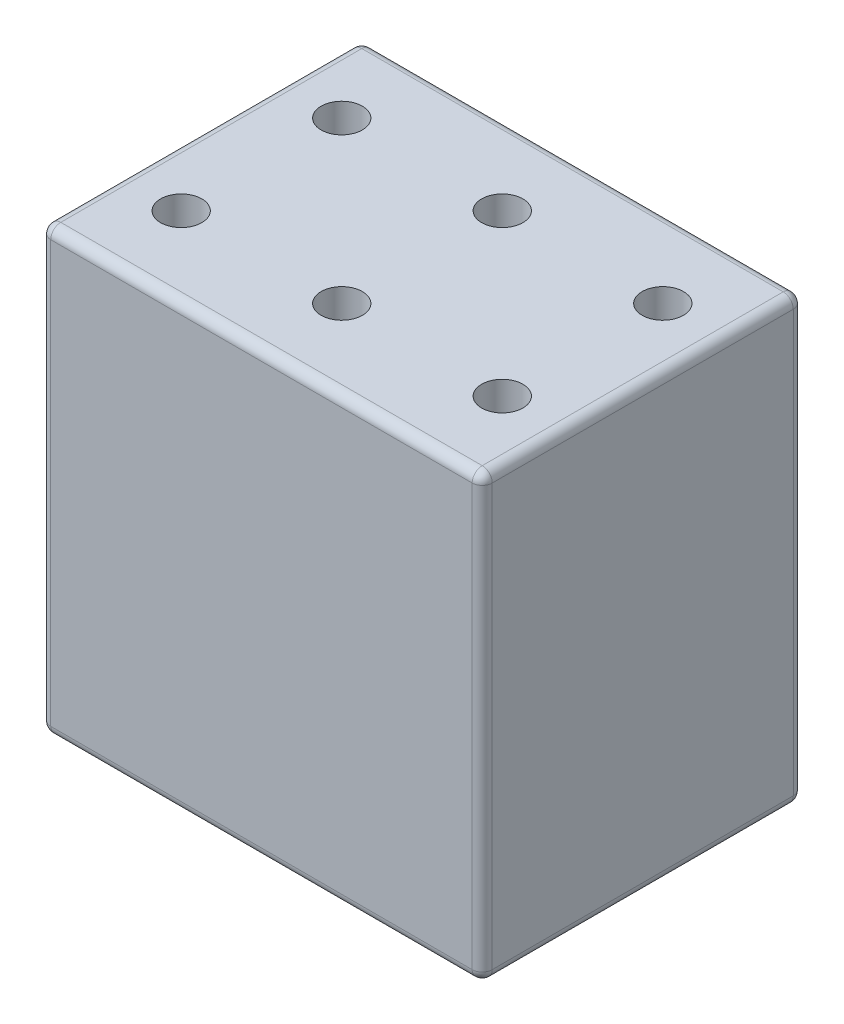
ISO-10303-21;
HEADER;
FILE_DESCRIPTION(('STEP AP214'),'2;1');
FILE_NAME('part.step','',(''),(''),'','','');
FILE_SCHEMA(('AUTOMOTIVE_DESIGN { 1 0 10303 214 1 1 1 1 }'));
ENDSEC;
DATA;
#1=APPLICATION_CONTEXT('core data for automotive mechanical design processes');
#2=APPLICATION_PROTOCOL_DEFINITION('international standard','automotive_design',2000,#1);
#3=PRODUCT_CONTEXT('',#1,'mechanical');
#4=PRODUCT('Part','Part','',(#3));
#5=PRODUCT_RELATED_PRODUCT_CATEGORY('part','',(#4));
#6=PRODUCT_DEFINITION_FORMATION('','',#4);
#7=PRODUCT_DEFINITION_CONTEXT('part definition',#1,'design');
#8=PRODUCT_DEFINITION('design','',#6,#7);
#9=PRODUCT_DEFINITION_SHAPE('','',#8);
#10=(LENGTH_UNIT() NAMED_UNIT(*) SI_UNIT(.MILLI.,.METRE.));
#11=(NAMED_UNIT(*) PLANE_ANGLE_UNIT() SI_UNIT($,.RADIAN.));
#12=(NAMED_UNIT(*) SI_UNIT($,.STERADIAN.) SOLID_ANGLE_UNIT());
#13=UNCERTAINTY_MEASURE_WITH_UNIT(LENGTH_MEASURE(1.E-05),#10,'distance_accuracy_value','');
#14=(GEOMETRIC_REPRESENTATION_CONTEXT(3) GLOBAL_UNCERTAINTY_ASSIGNED_CONTEXT((#13)) GLOBAL_UNIT_ASSIGNED_CONTEXT((#10,
#11,#12)) REPRESENTATION_CONTEXT('',''));
#15=CARTESIAN_POINT('',(0.,0.,0.));
#16=DIRECTION('',(0.,0.,1.));
#17=DIRECTION('',(1.,0.,0.));
#18=AXIS2_PLACEMENT_3D('',#15,#16,#17);
#19=CARTESIAN_POINT('',(0.,69.85,0.));
#20=DIRECTION('',(0.,-1.,0.));
#21=DIRECTION('',(0.,0.,-1.));
#22=AXIS2_PLACEMENT_3D('',#19,#20,#21);
#23=PLANE('',#22);
#24=DIRECTION('',(1.,0.,0.));
#25=VECTOR('',#24,1.);
#26=CARTESIAN_POINT('',(0.,69.85,23.8125));
#27=LINE('',#26,#25);
#28=CARTESIAN_POINT('',(-33.3375,69.85,23.8125));
#29=VERTEX_POINT('',#28);
#30=CARTESIAN_POINT('',(33.3375,69.85,23.8125));
#31=VERTEX_POINT('',#30);
#32=EDGE_CURVE('E164',#29,#31,#27,.T.);
#33=ORIENTED_EDGE('',*,*,#32,.T.);
#34=DIRECTION('',(0.,0.,-1.));
#35=VECTOR('',#34,1.);
#36=CARTESIAN_POINT('',(33.3375,69.85,0.));
#37=LINE('',#36,#35);
#38=CARTESIAN_POINT('',(33.3375,69.85,-23.8125));
#39=VERTEX_POINT('',#38);
#40=EDGE_CURVE('E169',#31,#39,#37,.T.);
#41=ORIENTED_EDGE('',*,*,#40,.T.);
#42=DIRECTION('',(-1.,0.,0.));
#43=VECTOR('',#42,1.);
#44=CARTESIAN_POINT('',(0.,69.85,-23.8125));
#45=LINE('',#44,#43);
#46=CARTESIAN_POINT('',(-33.3375,69.85,-23.8125));
#47=VERTEX_POINT('',#46);
#48=EDGE_CURVE('E138',#39,#47,#45,.T.);
#49=ORIENTED_EDGE('',*,*,#48,.T.);
#50=DIRECTION('',(0.,0.,1.));
#51=VECTOR('',#50,1.);
#52=CARTESIAN_POINT('',(-33.3375,69.85,0.));
#53=LINE('',#52,#51);
#54=EDGE_CURVE('E157',#47,#29,#53,.T.);
#55=ORIENTED_EDGE('',*,*,#54,.T.);
#56=EDGE_LOOP('',(#33,#41,#49,#55));
#57=FACE_BOUND('',#56,.T.);
#58=CARTESIAN_POINT('',(-25.4,69.85,12.7));
#59=DIRECTION('',(0.,1.,0.));
#60=DIRECTION('',(0.,0.,1.));
#61=AXIS2_PLACEMENT_3D('',#58,#59,#60);
#62=CIRCLE('',#61,3.2639);
#63=CARTESIAN_POINT('',(-25.4,69.85,15.9639));
#64=VERTEX_POINT('',#63);
#65=EDGE_CURVE('E165',#64,#64,#62,.T.);
#66=ORIENTED_EDGE('',*,*,#65,.F.);
#67=EDGE_LOOP('',(#66));
#68=FACE_BOUND('',#67,.T.);
#69=CARTESIAN_POINT('',(0.,69.85,12.7));
#70=DIRECTION('',(0.,1.,0.));
#71=DIRECTION('',(0.,0.,1.));
#72=AXIS2_PLACEMENT_3D('',#69,#70,#71);
#73=CIRCLE('',#72,3.2639);
#74=CARTESIAN_POINT('',(0.,69.85,15.9639));
#75=VERTEX_POINT('',#74);
#76=EDGE_CURVE('E353',#75,#75,#73,.T.);
#77=ORIENTED_EDGE('',*,*,#76,.F.);
#78=EDGE_LOOP('',(#77));
#79=FACE_BOUND('',#78,.T.);
#80=CARTESIAN_POINT('',(25.4,69.85,12.7));
#81=DIRECTION('',(0.,1.,0.));
#82=DIRECTION('',(0.,0.,1.));
#83=AXIS2_PLACEMENT_3D('',#80,#81,#82);
#84=CIRCLE('',#83,3.2639);
#85=CARTESIAN_POINT('',(25.4,69.85,15.9639));
#86=VERTEX_POINT('',#85);
#87=EDGE_CURVE('E345',#86,#86,#84,.T.);
#88=ORIENTED_EDGE('',*,*,#87,.F.);
#89=EDGE_LOOP('',(#88));
#90=FACE_BOUND('',#89,.T.);
#91=CARTESIAN_POINT('',(0.,69.85,-12.7));
#92=DIRECTION('',(0.,1.,0.));
#93=DIRECTION('',(0.,0.,1.));
#94=AXIS2_PLACEMENT_3D('',#91,#92,#93);
#95=CIRCLE('',#94,3.2639);
#96=CARTESIAN_POINT('',(0.,69.85,-9.43609999999999));
#97=VERTEX_POINT('',#96);
#98=EDGE_CURVE('E337',#97,#97,#95,.T.);
#99=ORIENTED_EDGE('',*,*,#98,.F.);
#100=EDGE_LOOP('',(#99));
#101=FACE_BOUND('',#100,.T.);
#102=CARTESIAN_POINT('',(25.3999999999999,69.85,-12.7));
#103=DIRECTION('',(0.,1.,0.));
#104=DIRECTION('',(0.,0.,1.));
#105=AXIS2_PLACEMENT_3D('',#102,#103,#104);
#106=CIRCLE('',#105,3.2639);
#107=CARTESIAN_POINT('',(25.3999999999999,69.85,-9.43609999999999));
#108=VERTEX_POINT('',#107);
#109=EDGE_CURVE('E329',#108,#108,#106,.T.);
#110=ORIENTED_EDGE('',*,*,#109,.F.);
#111=EDGE_LOOP('',(#110));
#112=FACE_BOUND('',#111,.T.);
#113=CARTESIAN_POINT('',(-25.4000000000001,69.85,-12.7));
#114=DIRECTION('',(0.,1.,0.));
#115=DIRECTION('',(0.,0.,1.));
#116=AXIS2_PLACEMENT_3D('',#113,#114,#115);
#117=CIRCLE('',#116,3.2639);
#118=CARTESIAN_POINT('',(-25.4000000000001,69.85,-9.43609999999999));
#119=VERTEX_POINT('',#118);
#120=EDGE_CURVE('E320',#119,#119,#117,.T.);
#121=ORIENTED_EDGE('',*,*,#120,.F.);
#122=EDGE_LOOP('',(#121));
#123=FACE_BOUND('',#122,.T.);
#124=ADVANCED_FACE('F43',(#57,#68,#79,#90,#101,#112,#123),#23,.F.);
#125=CARTESIAN_POINT('',(0.,0.,0.));
#126=DIRECTION('',(0.,-1.,0.));
#127=DIRECTION('',(0.,0.,-1.));
#128=AXIS2_PLACEMENT_3D('',#125,#126,#127);
#129=PLANE('',#128);
#130=DIRECTION('',(-1.,0.,0.));
#131=VECTOR('',#130,1.);
#132=CARTESIAN_POINT('',(34.925,0.,-23.8125));
#133=LINE('',#132,#131);
#134=CARTESIAN_POINT('',(-33.3375,0.,-23.8125));
#135=VERTEX_POINT('',#134);
#136=CARTESIAN_POINT('',(33.3375,0.,-23.8125));
#137=VERTEX_POINT('',#136);
#138=EDGE_CURVE('E195',#135,#137,#133,.F.);
#139=ORIENTED_EDGE('',*,*,#138,.T.);
#140=DIRECTION('',(0.,0.,-1.));
#141=VECTOR('',#140,1.);
#142=CARTESIAN_POINT('',(33.3375,0.,25.4));
#143=LINE('',#142,#141);
#144=CARTESIAN_POINT('',(33.3375,0.,23.8125));
#145=VERTEX_POINT('',#144);
#146=EDGE_CURVE('E199',#137,#145,#143,.F.);
#147=ORIENTED_EDGE('',*,*,#146,.T.);
#148=DIRECTION('',(1.,0.,0.));
#149=VECTOR('',#148,1.);
#150=CARTESIAN_POINT('',(-34.925,0.,23.8125));
#151=LINE('',#150,#149);
#152=CARTESIAN_POINT('',(-33.3375,0.,23.8125));
#153=VERTEX_POINT('',#152);
#154=EDGE_CURVE('E192',#145,#153,#151,.F.);
#155=ORIENTED_EDGE('',*,*,#154,.T.);
#156=DIRECTION('',(0.,0.,1.));
#157=VECTOR('',#156,1.);
#158=CARTESIAN_POINT('',(-33.3375,0.,-25.4));
#159=LINE('',#158,#157);
#160=EDGE_CURVE('E189',#153,#135,#159,.F.);
#161=ORIENTED_EDGE('',*,*,#160,.T.);
#162=EDGE_LOOP('',(#139,#147,#155,#161));
#163=FACE_BOUND('',#162,.T.);
#164=CARTESIAN_POINT('',(25.3999999999999,0.,-12.7));
#165=DIRECTION('',(0.,1.,0.));
#166=DIRECTION('',(0.,0.,1.));
#167=AXIS2_PLACEMENT_3D('',#164,#165,#166);
#168=CIRCLE('',#167,3.2639);
#169=CARTESIAN_POINT('',(25.3999999999999,0.,-9.43609999999999));
#170=VERTEX_POINT('',#169);
#171=EDGE_CURVE('E326',#170,#170,#168,.T.);
#172=ORIENTED_EDGE('',*,*,#171,.T.);
#173=EDGE_LOOP('',(#172));
#174=FACE_BOUND('',#173,.T.);
#175=CARTESIAN_POINT('',(25.4,0.,12.7));
#176=DIRECTION('',(0.,1.,0.));
#177=DIRECTION('',(0.,0.,1.));
#178=AXIS2_PLACEMENT_3D('',#175,#176,#177);
#179=CIRCLE('',#178,3.2639);
#180=CARTESIAN_POINT('',(25.4,0.,15.9639));
#181=VERTEX_POINT('',#180);
#182=EDGE_CURVE('E341',#181,#181,#179,.T.);
#183=ORIENTED_EDGE('',*,*,#182,.T.);
#184=EDGE_LOOP('',(#183));
#185=FACE_BOUND('',#184,.T.);
#186=CARTESIAN_POINT('',(-25.4,0.,12.7));
#187=DIRECTION('',(0.,1.,0.));
#188=DIRECTION('',(0.,0.,1.));
#189=AXIS2_PLACEMENT_3D('',#186,#187,#188);
#190=CIRCLE('',#189,3.2639);
#191=CARTESIAN_POINT('',(-25.4,0.,15.9639));
#192=VERTEX_POINT('',#191);
#193=EDGE_CURVE('E357',#192,#192,#190,.T.);
#194=ORIENTED_EDGE('',*,*,#193,.T.);
#195=EDGE_LOOP('',(#194));
#196=FACE_BOUND('',#195,.T.);
#197=CARTESIAN_POINT('',(0.,0.,12.7));
#198=DIRECTION('',(0.,1.,0.));
#199=DIRECTION('',(0.,0.,1.));
#200=AXIS2_PLACEMENT_3D('',#197,#198,#199);
#201=CIRCLE('',#200,3.2639);
#202=CARTESIAN_POINT('',(0.,0.,15.9639));
#203=VERTEX_POINT('',#202);
#204=EDGE_CURVE('E349',#203,#203,#201,.T.);
#205=ORIENTED_EDGE('',*,*,#204,.T.);
#206=EDGE_LOOP('',(#205));
#207=FACE_BOUND('',#206,.T.);
#208=CARTESIAN_POINT('',(0.,0.,-12.7));
#209=DIRECTION('',(0.,1.,0.));
#210=DIRECTION('',(0.,0.,1.));
#211=AXIS2_PLACEMENT_3D('',#208,#209,#210);
#212=CIRCLE('',#211,3.2639);
#213=CARTESIAN_POINT('',(0.,0.,-9.43609999999999));
#214=VERTEX_POINT('',#213);
#215=EDGE_CURVE('E333',#214,#214,#212,.T.);
#216=ORIENTED_EDGE('',*,*,#215,.T.);
#217=EDGE_LOOP('',(#216));
#218=FACE_BOUND('',#217,.T.);
#219=CARTESIAN_POINT('',(-25.4000000000001,0.,-12.7));
#220=DIRECTION('',(0.,1.,0.));
#221=DIRECTION('',(0.,0.,1.));
#222=AXIS2_PLACEMENT_3D('',#219,#220,#221);
#223=CIRCLE('',#222,3.2639);
#224=CARTESIAN_POINT('',(-25.4000000000001,0.,-9.43609999999999));
#225=VERTEX_POINT('',#224);
#226=EDGE_CURVE('E313',#225,#225,#223,.T.);
#227=ORIENTED_EDGE('',*,*,#226,.T.);
#228=EDGE_LOOP('',(#227));
#229=FACE_BOUND('',#228,.T.);
#230=ADVANCED_FACE('F368',(#163,#174,#185,#196,#207,#218,#229),#129,.T.);
#231=CARTESIAN_POINT('',(34.925,69.85,25.4));
#232=DIRECTION('',(-1.,0.,0.));
#233=DIRECTION('',(0.,0.,1.));
#234=AXIS2_PLACEMENT_3D('',#231,#232,#233);
#235=PLANE('',#234);
#236=DIRECTION('',(0.,0.,-1.));
#237=VECTOR('',#236,1.);
#238=CARTESIAN_POINT('',(34.925,68.2625,25.4));
#239=LINE('',#238,#237);
#240=CARTESIAN_POINT('',(34.925,68.2625,-23.8125));
#241=VERTEX_POINT('',#240);
#242=CARTESIAN_POINT('',(34.925,68.2625,23.8125));
#243=VERTEX_POINT('',#242);
#244=EDGE_CURVE('E221',#241,#243,#239,.F.);
#245=ORIENTED_EDGE('',*,*,#244,.T.);
#246=DIRECTION('',(0.,-1.,0.));
#247=VECTOR('',#246,1.);
#248=CARTESIAN_POINT('',(34.925,69.85,23.8125));
#249=LINE('',#248,#247);
#250=CARTESIAN_POINT('',(34.925,1.58750000000001,23.8125));
#251=VERTEX_POINT('',#250);
#252=EDGE_CURVE('E224',#243,#251,#249,.T.);
#253=ORIENTED_EDGE('',*,*,#252,.T.);
#254=DIRECTION('',(0.,0.,-1.));
#255=VECTOR('',#254,1.);
#256=CARTESIAN_POINT('',(34.925,1.58750000000001,-25.4));
#257=LINE('',#256,#255);
#258=CARTESIAN_POINT('',(34.925,1.58750000000001,-23.8125));
#259=VERTEX_POINT('',#258);
#260=EDGE_CURVE('E215',#251,#259,#257,.T.);
#261=ORIENTED_EDGE('',*,*,#260,.T.);
#262=DIRECTION('',(0.,-1.,0.));
#263=VECTOR('',#262,1.);
#264=CARTESIAN_POINT('',(34.925,69.85,-23.8125));
#265=LINE('',#264,#263);
#266=EDGE_CURVE('E218',#259,#241,#265,.F.);
#267=ORIENTED_EDGE('',*,*,#266,.T.);
#268=EDGE_LOOP('',(#245,#253,#261,#267));
#269=FACE_BOUND('',#268,.T.);
#270=ADVANCED_FACE('F392',(#269),#235,.F.);
#271=CARTESIAN_POINT('',(-34.925,69.85,-25.4));
#272=DIRECTION('',(0.,0.,1.));
#273=DIRECTION('',(1.,0.,0.));
#274=AXIS2_PLACEMENT_3D('',#271,#272,#273);
#275=PLANE('',#274);
#276=DIRECTION('',(-1.,0.,0.));
#277=VECTOR('',#276,1.);
#278=CARTESIAN_POINT('',(-34.925,68.2625,-25.4));
#279=LINE('',#278,#277);
#280=CARTESIAN_POINT('',(-33.3375,68.2625,-25.4));
#281=VERTEX_POINT('',#280);
#282=CARTESIAN_POINT('',(33.3375,68.2625,-25.4));
#283=VERTEX_POINT('',#282);
#284=EDGE_CURVE('E140',#281,#283,#279,.F.);
#285=ORIENTED_EDGE('',*,*,#284,.T.);
#286=DIRECTION('',(0.,-1.,0.));
#287=VECTOR('',#286,1.);
#288=CARTESIAN_POINT('',(33.3375,69.85,-25.4));
#289=LINE('',#288,#287);
#290=CARTESIAN_POINT('',(33.3375,1.58750000000001,-25.4));
#291=VERTEX_POINT('',#290);
#292=EDGE_CURVE('E186',#283,#291,#289,.T.);
#293=ORIENTED_EDGE('',*,*,#292,.T.);
#294=DIRECTION('',(-1.,0.,0.));
#295=VECTOR('',#294,1.);
#296=CARTESIAN_POINT('',(-34.925,1.58750000000001,-25.4));
#297=LINE('',#296,#295);
#298=CARTESIAN_POINT('',(-33.3375,1.58750000000001,-25.4));
#299=VERTEX_POINT('',#298);
#300=EDGE_CURVE('E181',#291,#299,#297,.T.);
#301=ORIENTED_EDGE('',*,*,#300,.T.);
#302=DIRECTION('',(0.,-1.,0.));
#303=VECTOR('',#302,1.);
#304=CARTESIAN_POINT('',(-33.3375,69.85,-25.4));
#305=LINE('',#304,#303);
#306=EDGE_CURVE('E175',#299,#281,#305,.F.);
#307=ORIENTED_EDGE('',*,*,#306,.T.);
#308=EDGE_LOOP('',(#285,#293,#301,#307));
#309=FACE_BOUND('',#308,.T.);
#310=ADVANCED_FACE('F398',(#309),#275,.F.);
#311=CARTESIAN_POINT('',(-34.925,69.85,25.4));
#312=DIRECTION('',(1.,0.,0.));
#313=DIRECTION('',(0.,0.,-1.));
#314=AXIS2_PLACEMENT_3D('',#311,#312,#313);
#315=PLANE('',#314);
#316=DIRECTION('',(0.,0.,1.));
#317=VECTOR('',#316,1.);
#318=CARTESIAN_POINT('',(-34.925,68.2625,25.4));
#319=LINE('',#318,#317);
#320=CARTESIAN_POINT('',(-34.925,68.2625,23.8125));
#321=VERTEX_POINT('',#320);
#322=CARTESIAN_POINT('',(-34.925,68.2625,-23.8125));
#323=VERTEX_POINT('',#322);
#324=EDGE_CURVE('E53',#321,#323,#319,.F.);
#325=ORIENTED_EDGE('',*,*,#324,.T.);
#326=DIRECTION('',(0.,-1.,0.));
#327=VECTOR('',#326,1.);
#328=CARTESIAN_POINT('',(-34.925,69.85,-23.8125));
#329=LINE('',#328,#327);
#330=CARTESIAN_POINT('',(-34.925,1.58750000000001,-23.8125));
#331=VERTEX_POINT('',#330);
#332=EDGE_CURVE('E11',#323,#331,#329,.T.);
#333=ORIENTED_EDGE('',*,*,#332,.T.);
#334=DIRECTION('',(0.,0.,1.));
#335=VECTOR('',#334,1.);
#336=CARTESIAN_POINT('',(-34.925,1.58750000000001,25.4));
#337=LINE('',#336,#335);
#338=CARTESIAN_POINT('',(-34.925,1.58750000000001,23.8125));
#339=VERTEX_POINT('',#338);
#340=EDGE_CURVE('E228',#331,#339,#337,.T.);
#341=ORIENTED_EDGE('',*,*,#340,.T.);
#342=DIRECTION('',(0.,-1.,0.));
#343=VECTOR('',#342,1.);
#344=CARTESIAN_POINT('',(-34.925,69.85,23.8125));
#345=LINE('',#344,#343);
#346=EDGE_CURVE('E64',#339,#321,#345,.F.);
#347=ORIENTED_EDGE('',*,*,#346,.T.);
#348=EDGE_LOOP('',(#325,#333,#341,#347));
#349=FACE_BOUND('',#348,.T.);
#350=ADVANCED_FACE('F384',(#349),#315,.F.);
#351=CARTESIAN_POINT('',(-34.925,69.85,25.4));
#352=DIRECTION('',(0.,0.,-1.));
#353=DIRECTION('',(-1.,0.,0.));
#354=AXIS2_PLACEMENT_3D('',#351,#352,#353);
#355=PLANE('',#354);
#356=DIRECTION('',(1.,0.,0.));
#357=VECTOR('',#356,1.);
#358=CARTESIAN_POINT('',(34.925,1.58750000000001,25.4));
#359=LINE('',#358,#357);
#360=CARTESIAN_POINT('',(-33.3375,1.58750000000001,25.4));
#361=VERTEX_POINT('',#360);
#362=CARTESIAN_POINT('',(33.3375,1.58750000000001,25.4));
#363=VERTEX_POINT('',#362);
#364=EDGE_CURVE('E205',#361,#363,#359,.T.);
#365=ORIENTED_EDGE('',*,*,#364,.T.);
#366=DIRECTION('',(0.,-1.,0.));
#367=VECTOR('',#366,1.);
#368=CARTESIAN_POINT('',(33.3375,69.85,25.4));
#369=LINE('',#368,#367);
#370=CARTESIAN_POINT('',(33.3375,68.2625,25.4));
#371=VERTEX_POINT('',#370);
#372=EDGE_CURVE('E212',#363,#371,#369,.F.);
#373=ORIENTED_EDGE('',*,*,#372,.T.);
#374=DIRECTION('',(1.,0.,0.));
#375=VECTOR('',#374,1.);
#376=CARTESIAN_POINT('',(-34.925,68.2625,25.4));
#377=LINE('',#376,#375);
#378=CARTESIAN_POINT('',(-33.3375,68.2625,25.4));
#379=VERTEX_POINT('',#378);
#380=EDGE_CURVE('E208',#371,#379,#377,.F.);
#381=ORIENTED_EDGE('',*,*,#380,.T.);
#382=DIRECTION('',(0.,-1.,0.));
#383=VECTOR('',#382,1.);
#384=CARTESIAN_POINT('',(-33.3375,69.85,25.4));
#385=LINE('',#384,#383);
#386=EDGE_CURVE('E202',#379,#361,#385,.T.);
#387=ORIENTED_EDGE('',*,*,#386,.T.);
#388=EDGE_LOOP('',(#365,#373,#381,#387));
#389=FACE_BOUND('',#388,.T.);
#390=ADVANCED_FACE('F374',(#389),#355,.F.);
#391=CARTESIAN_POINT('',(-25.4,69.85,12.7));
#392=DIRECTION('',(0.,-1.,0.));
#393=DIRECTION('',(0.,0.,-1.));
#394=AXIS2_PLACEMENT_3D('',#391,#392,#393);
#395=CYLINDRICAL_SURFACE('',#394,3.2639);
#396=ORIENTED_EDGE('',*,*,#65,.T.);
#397=EDGE_LOOP('',(#396));
#398=FACE_BOUND('',#397,.T.);
#399=ORIENTED_EDGE('',*,*,#193,.F.);
#400=EDGE_LOOP('',(#399));
#401=FACE_BOUND('',#400,.T.);
#402=ADVANCED_FACE('F371',(#398,#401),#395,.F.);
#403=CARTESIAN_POINT('',(0.,69.85,12.7));
#404=DIRECTION('',(0.,-1.,0.));
#405=DIRECTION('',(0.,0.,-1.));
#406=AXIS2_PLACEMENT_3D('',#403,#404,#405);
#407=CYLINDRICAL_SURFACE('',#406,3.2639);
#408=ORIENTED_EDGE('',*,*,#76,.T.);
#409=EDGE_LOOP('',(#408));
#410=FACE_BOUND('',#409,.T.);
#411=ORIENTED_EDGE('',*,*,#204,.F.);
#412=EDGE_LOOP('',(#411));
#413=FACE_BOUND('',#412,.T.);
#414=ADVANCED_FACE('F373',(#410,#413),#407,.F.);
#415=CARTESIAN_POINT('',(25.4,69.85,12.7));
#416=DIRECTION('',(0.,-1.,0.));
#417=DIRECTION('',(0.,0.,-1.));
#418=AXIS2_PLACEMENT_3D('',#415,#416,#417);
#419=CYLINDRICAL_SURFACE('',#418,3.2639);
#420=ORIENTED_EDGE('',*,*,#87,.T.);
#421=EDGE_LOOP('',(#420));
#422=FACE_BOUND('',#421,.T.);
#423=ORIENTED_EDGE('',*,*,#182,.F.);
#424=EDGE_LOOP('',(#423));
#425=FACE_BOUND('',#424,.T.);
#426=ADVANCED_FACE('F381',(#422,#425),#419,.F.);
#427=CARTESIAN_POINT('',(0.,69.85,-12.7));
#428=DIRECTION('',(0.,-1.,0.));
#429=DIRECTION('',(0.,0.,-1.));
#430=AXIS2_PLACEMENT_3D('',#427,#428,#429);
#431=CYLINDRICAL_SURFACE('',#430,3.2639);
#432=ORIENTED_EDGE('',*,*,#98,.T.);
#433=EDGE_LOOP('',(#432));
#434=FACE_BOUND('',#433,.T.);
#435=ORIENTED_EDGE('',*,*,#215,.F.);
#436=EDGE_LOOP('',(#435));
#437=FACE_BOUND('',#436,.T.);
#438=ADVANCED_FACE('F509',(#434,#437),#431,.F.);
#439=CARTESIAN_POINT('',(25.3999999999999,69.85,-12.7));
#440=DIRECTION('',(0.,-1.,0.));
#441=DIRECTION('',(0.,0.,-1.));
#442=AXIS2_PLACEMENT_3D('',#439,#440,#441);
#443=CYLINDRICAL_SURFACE('',#442,3.2639);
#444=ORIENTED_EDGE('',*,*,#109,.T.);
#445=EDGE_LOOP('',(#444));
#446=FACE_BOUND('',#445,.T.);
#447=ORIENTED_EDGE('',*,*,#171,.F.);
#448=EDGE_LOOP('',(#447));
#449=FACE_BOUND('',#448,.T.);
#450=ADVANCED_FACE('F515',(#446,#449),#443,.F.);
#451=CARTESIAN_POINT('',(-25.4000000000001,69.85,-12.7));
#452=DIRECTION('',(0.,-1.,0.));
#453=DIRECTION('',(0.,0.,-1.));
#454=AXIS2_PLACEMENT_3D('',#451,#452,#453);
#455=CYLINDRICAL_SURFACE('',#454,3.2639);
#456=ORIENTED_EDGE('',*,*,#120,.T.);
#457=EDGE_LOOP('',(#456));
#458=FACE_BOUND('',#457,.T.);
#459=ORIENTED_EDGE('',*,*,#226,.F.);
#460=EDGE_LOOP('',(#459));
#461=FACE_BOUND('',#460,.T.);
#462=ADVANCED_FACE('F474',(#458,#461),#455,.F.);
#463=CARTESIAN_POINT('',(-34.925,1.58750000000001,23.8125));
#464=DIRECTION('',(-1.,0.,0.));
#465=DIRECTION('',(0.,0.,1.));
#466=AXIS2_PLACEMENT_3D('',#463,#464,#465);
#467=CYLINDRICAL_SURFACE('',#466,1.5875);
#468=CARTESIAN_POINT('',(33.3375,1.58750000000001,23.8125));
#469=DIRECTION('',(1.,0.,0.));
#470=DIRECTION('',(0.,0.,-1.));
#471=AXIS2_PLACEMENT_3D('',#468,#469,#470);
#472=CIRCLE('',#471,1.5875);
#473=EDGE_CURVE('E47',#363,#145,#472,.T.);
#474=ORIENTED_EDGE('',*,*,#473,.F.);
#475=ORIENTED_EDGE('',*,*,#364,.F.);
#476=CARTESIAN_POINT('',(-33.3375,1.5875,23.8125));
#477=DIRECTION('',(-1.,0.,0.));
#478=DIRECTION('',(0.,0.,1.));
#479=AXIS2_PLACEMENT_3D('',#476,#477,#478);
#480=CIRCLE('',#479,1.5875);
#481=EDGE_CURVE('E304',#153,#361,#480,.T.);
#482=ORIENTED_EDGE('',*,*,#481,.F.);
#483=ORIENTED_EDGE('',*,*,#154,.F.);
#484=EDGE_LOOP('',(#474,#475,#482,#483));
#485=FACE_BOUND('',#484,.T.);
#486=ADVANCED_FACE('F45',(#485),#467,.T.);
#487=CARTESIAN_POINT('',(33.3375,1.5875,23.8125));
#488=DIRECTION('',(0.,-1.,0.));
#489=DIRECTION('',(0.,0.,-1.));
#490=AXIS2_PLACEMENT_3D('',#487,#488,#489);
#491=SPHERICAL_SURFACE('',#490,1.5875);
#492=CARTESIAN_POINT('',(33.3375,1.58750000000001,23.8125));
#493=DIRECTION('',(0.,-1.,0.));
#494=DIRECTION('',(0.,0.,-1.));
#495=AXIS2_PLACEMENT_3D('',#492,#493,#494);
#496=CIRCLE('',#495,1.5875);
#497=EDGE_CURVE('E297',#363,#251,#496,.F.);
#498=ORIENTED_EDGE('',*,*,#497,.F.);
#499=ORIENTED_EDGE('',*,*,#473,.T.);
#500=CARTESIAN_POINT('',(33.3375,1.5875,23.8125));
#501=DIRECTION('',(0.,0.,1.));
#502=DIRECTION('',(1.,0.,0.));
#503=AXIS2_PLACEMENT_3D('',#500,#501,#502);
#504=CIRCLE('',#503,1.5875);
#505=EDGE_CURVE('E301',#251,#145,#504,.F.);
#506=ORIENTED_EDGE('',*,*,#505,.F.);
#507=EDGE_LOOP('',(#498,#499,#506));
#508=FACE_BOUND('',#507,.T.);
#509=ADVANCED_FACE('F469',(#508),#491,.T.);
#510=CARTESIAN_POINT('',(-33.3375,1.5875,23.8125));
#511=DIRECTION('',(0.,0.,1.));
#512=DIRECTION('',(0.,-1.,0.));
#513=AXIS2_PLACEMENT_3D('',#510,#511,#512);
#514=SPHERICAL_SURFACE('',#513,1.5875);
#515=CARTESIAN_POINT('',(-33.3375,1.58750000000001,23.8125));
#516=DIRECTION('',(0.,0.,1.));
#517=DIRECTION('',(1.,0.,0.));
#518=AXIS2_PLACEMENT_3D('',#515,#516,#517);
#519=CIRCLE('',#518,1.5875);
#520=EDGE_CURVE('E289',#153,#339,#519,.F.);
#521=ORIENTED_EDGE('',*,*,#520,.F.);
#522=ORIENTED_EDGE('',*,*,#481,.T.);
#523=CARTESIAN_POINT('',(-33.3375,1.58750000000001,23.8125));
#524=DIRECTION('',(0.,-1.,0.));
#525=DIRECTION('',(0.,0.,-1.));
#526=AXIS2_PLACEMENT_3D('',#523,#524,#525);
#527=CIRCLE('',#526,1.5875);
#528=EDGE_CURVE('E293',#339,#361,#527,.F.);
#529=ORIENTED_EDGE('',*,*,#528,.F.);
#530=EDGE_LOOP('',(#521,#522,#529));
#531=FACE_BOUND('',#530,.T.);
#532=ADVANCED_FACE('F466',(#531),#514,.T.);
#533=CARTESIAN_POINT('',(33.3375,1.58750000000001,25.4));
#534=DIRECTION('',(0.,0.,1.));
#535=DIRECTION('',(1.,0.,0.));
#536=AXIS2_PLACEMENT_3D('',#533,#534,#535);
#537=CYLINDRICAL_SURFACE('',#536,1.5875);
#538=ORIENTED_EDGE('',*,*,#505,.T.);
#539=ORIENTED_EDGE('',*,*,#146,.F.);
#540=CARTESIAN_POINT('',(33.3375,1.58750000000001,-23.8125));
#541=DIRECTION('',(0.,0.,-1.));
#542=DIRECTION('',(-1.,0.,0.));
#543=AXIS2_PLACEMENT_3D('',#540,#541,#542);
#544=CIRCLE('',#543,1.5875);
#545=EDGE_CURVE('E282',#259,#137,#544,.T.);
#546=ORIENTED_EDGE('',*,*,#545,.F.);
#547=ORIENTED_EDGE('',*,*,#260,.F.);
#548=EDGE_LOOP('',(#538,#539,#546,#547));
#549=FACE_BOUND('',#548,.T.);
#550=ADVANCED_FACE('F462',(#549),#537,.T.);
#551=CARTESIAN_POINT('',(33.3375,69.85,23.8125));
#552=DIRECTION('',(0.,-1.,0.));
#553=DIRECTION('',(0.,0.,-1.));
#554=AXIS2_PLACEMENT_3D('',#551,#552,#553);
#555=CYLINDRICAL_SURFACE('',#554,1.5875);
#556=ORIENTED_EDGE('',*,*,#497,.T.);
#557=ORIENTED_EDGE('',*,*,#252,.F.);
#558=CARTESIAN_POINT('',(33.3375,68.2625,23.8125));
#559=DIRECTION('',(0.,1.,0.));
#560=DIRECTION('',(0.,0.,1.));
#561=AXIS2_PLACEMENT_3D('',#558,#559,#560);
#562=CIRCLE('',#561,1.5875);
#563=EDGE_CURVE('E278',#371,#243,#562,.T.);
#564=ORIENTED_EDGE('',*,*,#563,.F.);
#565=ORIENTED_EDGE('',*,*,#372,.F.);
#566=EDGE_LOOP('',(#556,#557,#564,#565));
#567=FACE_BOUND('',#566,.T.);
#568=ADVANCED_FACE('F458',(#567),#555,.T.);
#569=CARTESIAN_POINT('',(0.,68.2625,23.8125));
#570=DIRECTION('',(1.,0.,0.));
#571=DIRECTION('',(0.,0.,-1.));
#572=AXIS2_PLACEMENT_3D('',#569,#570,#571);
#573=CYLINDRICAL_SURFACE('',#572,1.5875);
#574=CARTESIAN_POINT('',(-33.3375,68.2625,23.8125));
#575=DIRECTION('',(-1.,0.,0.));
#576=DIRECTION('',(0.,0.,1.));
#577=AXIS2_PLACEMENT_3D('',#574,#575,#576);
#578=CIRCLE('',#577,1.5875);
#579=EDGE_CURVE('E270',#379,#29,#578,.T.);
#580=ORIENTED_EDGE('',*,*,#579,.F.);
#581=ORIENTED_EDGE('',*,*,#380,.F.);
#582=CARTESIAN_POINT('',(33.3375,68.2625,23.8125));
#583=DIRECTION('',(1.,0.,0.));
#584=DIRECTION('',(0.,0.,-1.));
#585=AXIS2_PLACEMENT_3D('',#582,#583,#584);
#586=CIRCLE('',#585,1.5875);
#587=EDGE_CURVE('E274',#31,#371,#586,.T.);
#588=ORIENTED_EDGE('',*,*,#587,.F.);
#589=ORIENTED_EDGE('',*,*,#32,.F.);
#590=EDGE_LOOP('',(#580,#581,#588,#589));
#591=FACE_BOUND('',#590,.T.);
#592=ADVANCED_FACE('F454',(#591),#573,.T.);
#593=CARTESIAN_POINT('',(-33.3375,69.85,23.8125));
#594=DIRECTION('',(0.,-1.,0.));
#595=DIRECTION('',(0.,0.,-1.));
#596=AXIS2_PLACEMENT_3D('',#593,#594,#595);
#597=CYLINDRICAL_SURFACE('',#596,1.5875);
#598=ORIENTED_EDGE('',*,*,#528,.T.);
#599=ORIENTED_EDGE('',*,*,#386,.F.);
#600=CARTESIAN_POINT('',(-33.3375,68.2625,23.8125));
#601=DIRECTION('',(0.,1.,0.));
#602=DIRECTION('',(0.,0.,1.));
#603=AXIS2_PLACEMENT_3D('',#600,#601,#602);
#604=CIRCLE('',#603,1.5875);
#605=EDGE_CURVE('E267',#321,#379,#604,.T.);
#606=ORIENTED_EDGE('',*,*,#605,.F.);
#607=ORIENTED_EDGE('',*,*,#346,.F.);
#608=EDGE_LOOP('',(#598,#599,#606,#607));
#609=FACE_BOUND('',#608,.T.);
#610=ADVANCED_FACE('F450',(#609),#597,.T.);
#611=CARTESIAN_POINT('',(-33.3375,1.58750000000001,25.4));
#612=DIRECTION('',(0.,0.,-1.));
#613=DIRECTION('',(-1.,0.,0.));
#614=AXIS2_PLACEMENT_3D('',#611,#612,#613);
#615=CYLINDRICAL_SURFACE('',#614,1.5875);
#616=ORIENTED_EDGE('',*,*,#520,.T.);
#617=ORIENTED_EDGE('',*,*,#340,.F.);
#618=CARTESIAN_POINT('',(-33.3375,1.5875,-23.8125));
#619=DIRECTION('',(0.,0.,-1.));
#620=DIRECTION('',(-1.,0.,0.));
#621=AXIS2_PLACEMENT_3D('',#618,#619,#620);
#622=CIRCLE('',#621,1.5875);
#623=EDGE_CURVE('E263',#135,#331,#622,.T.);
#624=ORIENTED_EDGE('',*,*,#623,.F.);
#625=ORIENTED_EDGE('',*,*,#160,.F.);
#626=EDGE_LOOP('',(#616,#617,#624,#625));
#627=FACE_BOUND('',#626,.T.);
#628=ADVANCED_FACE('F446',(#627),#615,.T.);
#629=CARTESIAN_POINT('',(-34.925,1.58750000000001,-23.8125));
#630=DIRECTION('',(1.,0.,0.));
#631=DIRECTION('',(0.,0.,-1.));
#632=AXIS2_PLACEMENT_3D('',#629,#630,#631);
#633=CYLINDRICAL_SURFACE('',#632,1.5875);
#634=CARTESIAN_POINT('',(33.3375,1.5875,-23.8125));
#635=DIRECTION('',(1.,0.,0.));
#636=DIRECTION('',(0.,0.,-1.));
#637=AXIS2_PLACEMENT_3D('',#634,#635,#636);
#638=CIRCLE('',#637,1.5875);
#639=EDGE_CURVE('E285',#137,#291,#638,.T.);
#640=ORIENTED_EDGE('',*,*,#639,.F.);
#641=ORIENTED_EDGE('',*,*,#138,.F.);
#642=CARTESIAN_POINT('',(-33.3375,1.58750000000001,-23.8125));
#643=DIRECTION('',(-1.,0.,0.));
#644=DIRECTION('',(0.,0.,1.));
#645=AXIS2_PLACEMENT_3D('',#642,#643,#644);
#646=CIRCLE('',#645,1.5875);
#647=EDGE_CURVE('E259',#299,#135,#646,.T.);
#648=ORIENTED_EDGE('',*,*,#647,.F.);
#649=ORIENTED_EDGE('',*,*,#300,.F.);
#650=EDGE_LOOP('',(#640,#641,#648,#649));
#651=FACE_BOUND('',#650,.T.);
#652=ADVANCED_FACE('F442',(#651),#633,.T.);
#653=CARTESIAN_POINT('',(33.3375,1.5875,-23.8125));
#654=DIRECTION('',(0.,-1.,0.));
#655=DIRECTION('',(0.,0.,-1.));
#656=AXIS2_PLACEMENT_3D('',#653,#654,#655);
#657=SPHERICAL_SURFACE('',#656,1.5875);
#658=ORIENTED_EDGE('',*,*,#545,.T.);
#659=ORIENTED_EDGE('',*,*,#639,.T.);
#660=CARTESIAN_POINT('',(33.3375,1.58750000000001,-23.8125));
#661=DIRECTION('',(0.,-1.,0.));
#662=DIRECTION('',(0.,0.,-1.));
#663=AXIS2_PLACEMENT_3D('',#660,#661,#662);
#664=CIRCLE('',#663,1.5875);
#665=EDGE_CURVE('E255',#259,#291,#664,.F.);
#666=ORIENTED_EDGE('',*,*,#665,.F.);
#667=EDGE_LOOP('',(#658,#659,#666));
#668=FACE_BOUND('',#667,.T.);
#669=ADVANCED_FACE('F438',(#668),#657,.T.);
#670=CARTESIAN_POINT('',(33.3375,68.2625,23.8125));
#671=DIRECTION('',(0.,0.,1.));
#672=DIRECTION('',(1.,0.,0.));
#673=AXIS2_PLACEMENT_3D('',#670,#671,#672);
#674=SPHERICAL_SURFACE('',#673,1.5875);
#675=ORIENTED_EDGE('',*,*,#587,.T.);
#676=ORIENTED_EDGE('',*,*,#563,.T.);
#677=CARTESIAN_POINT('',(33.3375,68.2625,23.8125));
#678=DIRECTION('',(0.,0.,1.));
#679=DIRECTION('',(1.,0.,0.));
#680=AXIS2_PLACEMENT_3D('',#677,#678,#679);
#681=CIRCLE('',#680,1.5875);
#682=EDGE_CURVE('E251',#31,#243,#681,.F.);
#683=ORIENTED_EDGE('',*,*,#682,.F.);
#684=EDGE_LOOP('',(#675,#676,#683));
#685=FACE_BOUND('',#684,.T.);
#686=ADVANCED_FACE('F434',(#685),#674,.T.);
#687=CARTESIAN_POINT('',(-33.3375,68.2625,23.8125));
#688=DIRECTION('',(0.,0.,1.));
#689=DIRECTION('',(1.,0.,0.));
#690=AXIS2_PLACEMENT_3D('',#687,#688,#689);
#691=SPHERICAL_SURFACE('',#690,1.5875);
#692=ORIENTED_EDGE('',*,*,#605,.T.);
#693=ORIENTED_EDGE('',*,*,#579,.T.);
#694=CARTESIAN_POINT('',(-33.3375,68.2625,23.8125));
#695=DIRECTION('',(0.,0.,1.));
#696=DIRECTION('',(1.,0.,0.));
#697=AXIS2_PLACEMENT_3D('',#694,#695,#696);
#698=CIRCLE('',#697,1.5875);
#699=EDGE_CURVE('E160',#321,#29,#698,.F.);
#700=ORIENTED_EDGE('',*,*,#699,.F.);
#701=EDGE_LOOP('',(#692,#693,#700));
#702=FACE_BOUND('',#701,.T.);
#703=ADVANCED_FACE('F430',(#702),#691,.T.);
#704=CARTESIAN_POINT('',(-33.3375,1.5875,-23.8125));
#705=DIRECTION('',(0.,-1.,0.));
#706=DIRECTION('',(0.,0.,-1.));
#707=AXIS2_PLACEMENT_3D('',#704,#705,#706);
#708=SPHERICAL_SURFACE('',#707,1.5875);
#709=ORIENTED_EDGE('',*,*,#647,.T.);
#710=ORIENTED_EDGE('',*,*,#623,.T.);
#711=CARTESIAN_POINT('',(-33.3375,1.58750000000001,-23.8125));
#712=DIRECTION('',(0.,-1.,0.));
#713=DIRECTION('',(0.,0.,-1.));
#714=AXIS2_PLACEMENT_3D('',#711,#712,#713);
#715=CIRCLE('',#714,1.5875);
#716=EDGE_CURVE('E246',#299,#331,#715,.F.);
#717=ORIENTED_EDGE('',*,*,#716,.F.);
#718=EDGE_LOOP('',(#709,#710,#717));
#719=FACE_BOUND('',#718,.T.);
#720=ADVANCED_FACE('F426',(#719),#708,.T.);
#721=CARTESIAN_POINT('',(33.3375,69.85,-23.8125));
#722=DIRECTION('',(0.,-1.,0.));
#723=DIRECTION('',(0.,0.,-1.));
#724=AXIS2_PLACEMENT_3D('',#721,#722,#723);
#725=CYLINDRICAL_SURFACE('',#724,1.5875);
#726=ORIENTED_EDGE('',*,*,#665,.T.);
#727=ORIENTED_EDGE('',*,*,#292,.F.);
#728=CARTESIAN_POINT('',(33.3375,68.2625,-23.8125));
#729=DIRECTION('',(0.,1.,0.));
#730=DIRECTION('',(0.,0.,1.));
#731=AXIS2_PLACEMENT_3D('',#728,#729,#730);
#732=CIRCLE('',#731,1.5875);
#733=EDGE_CURVE('E242',#241,#283,#732,.T.);
#734=ORIENTED_EDGE('',*,*,#733,.F.);
#735=ORIENTED_EDGE('',*,*,#266,.F.);
#736=EDGE_LOOP('',(#726,#727,#734,#735));
#737=FACE_BOUND('',#736,.T.);
#738=ADVANCED_FACE('F422',(#737),#725,.T.);
#739=CARTESIAN_POINT('',(33.3375,68.2625,0.));
#740=DIRECTION('',(0.,0.,-1.));
#741=DIRECTION('',(-1.,0.,0.));
#742=AXIS2_PLACEMENT_3D('',#739,#740,#741);
#743=CYLINDRICAL_SURFACE('',#742,1.5875);
#744=ORIENTED_EDGE('',*,*,#682,.T.);
#745=ORIENTED_EDGE('',*,*,#244,.F.);
#746=CARTESIAN_POINT('',(33.3375,68.2625,-23.8125));
#747=DIRECTION('',(0.,0.,-1.));
#748=DIRECTION('',(-1.,0.,0.));
#749=AXIS2_PLACEMENT_3D('',#746,#747,#748);
#750=CIRCLE('',#749,1.5875);
#751=EDGE_CURVE('E154',#39,#241,#750,.T.);
#752=ORIENTED_EDGE('',*,*,#751,.F.);
#753=ORIENTED_EDGE('',*,*,#40,.F.);
#754=EDGE_LOOP('',(#744,#745,#752,#753));
#755=FACE_BOUND('',#754,.T.);
#756=ADVANCED_FACE('F419',(#755),#743,.T.);
#757=CARTESIAN_POINT('',(-33.3375,68.2625,0.));
#758=DIRECTION('',(0.,0.,1.));
#759=DIRECTION('',(1.,0.,0.));
#760=AXIS2_PLACEMENT_3D('',#757,#758,#759);
#761=CYLINDRICAL_SURFACE('',#760,1.5875);
#762=ORIENTED_EDGE('',*,*,#699,.T.);
#763=ORIENTED_EDGE('',*,*,#54,.F.);
#764=CARTESIAN_POINT('',(-33.3375,68.2625,-23.8125));
#765=DIRECTION('',(0.,0.,-1.));
#766=DIRECTION('',(-1.,0.,0.));
#767=AXIS2_PLACEMENT_3D('',#764,#765,#766);
#768=CIRCLE('',#767,1.5875);
#769=EDGE_CURVE('E147',#323,#47,#768,.T.);
#770=ORIENTED_EDGE('',*,*,#769,.F.);
#771=ORIENTED_EDGE('',*,*,#324,.F.);
#772=EDGE_LOOP('',(#762,#763,#770,#771));
#773=FACE_BOUND('',#772,.T.);
#774=ADVANCED_FACE('F158',(#773),#761,.T.);
#775=CARTESIAN_POINT('',(-33.3375,69.85,-23.8125));
#776=DIRECTION('',(0.,-1.,0.));
#777=DIRECTION('',(0.,0.,-1.));
#778=AXIS2_PLACEMENT_3D('',#775,#776,#777);
#779=CYLINDRICAL_SURFACE('',#778,1.5875);
#780=ORIENTED_EDGE('',*,*,#716,.T.);
#781=ORIENTED_EDGE('',*,*,#332,.F.);
#782=CARTESIAN_POINT('',(-33.3375,68.2625,-23.8125));
#783=DIRECTION('',(0.,1.,0.));
#784=DIRECTION('',(0.,0.,1.));
#785=AXIS2_PLACEMENT_3D('',#782,#783,#784);
#786=CIRCLE('',#785,1.5875);
#787=EDGE_CURVE('E151',#281,#323,#786,.T.);
#788=ORIENTED_EDGE('',*,*,#787,.F.);
#789=ORIENTED_EDGE('',*,*,#306,.F.);
#790=EDGE_LOOP('',(#780,#781,#788,#789));
#791=FACE_BOUND('',#790,.T.);
#792=ADVANCED_FACE('F412',(#791),#779,.T.);
#793=CARTESIAN_POINT('',(33.3375,68.2625,-23.8125));
#794=DIRECTION('',(1.,0.,0.));
#795=DIRECTION('',(0.,0.,-1.));
#796=AXIS2_PLACEMENT_3D('',#793,#794,#795);
#797=SPHERICAL_SURFACE('',#796,1.5875);
#798=ORIENTED_EDGE('',*,*,#751,.T.);
#799=ORIENTED_EDGE('',*,*,#733,.T.);
#800=CARTESIAN_POINT('',(33.3375,68.2625,-23.8125));
#801=DIRECTION('',(1.,0.,0.));
#802=DIRECTION('',(0.,1.,0.));
#803=AXIS2_PLACEMENT_3D('',#800,#801,#802);
#804=CIRCLE('',#803,1.5875);
#805=EDGE_CURVE('E144',#39,#283,#804,.F.);
#806=ORIENTED_EDGE('',*,*,#805,.F.);
#807=EDGE_LOOP('',(#798,#799,#806));
#808=FACE_BOUND('',#807,.T.);
#809=ADVANCED_FACE('F409',(#808),#797,.T.);
#810=CARTESIAN_POINT('',(-33.3375,68.2625,-23.8125));
#811=DIRECTION('',(-1.,0.,0.));
#812=DIRECTION('',(0.,0.,1.));
#813=AXIS2_PLACEMENT_3D('',#810,#811,#812);
#814=SPHERICAL_SURFACE('',#813,1.5875);
#815=ORIENTED_EDGE('',*,*,#787,.T.);
#816=ORIENTED_EDGE('',*,*,#769,.T.);
#817=CARTESIAN_POINT('',(-33.3375,68.2625,-23.8125));
#818=DIRECTION('',(-1.,0.,0.));
#819=DIRECTION('',(0.,0.,1.));
#820=AXIS2_PLACEMENT_3D('',#817,#818,#819);
#821=CIRCLE('',#820,1.5875);
#822=EDGE_CURVE('E134',#281,#47,#821,.F.);
#823=ORIENTED_EDGE('',*,*,#822,.F.);
#824=EDGE_LOOP('',(#815,#816,#823));
#825=FACE_BOUND('',#824,.T.);
#826=ADVANCED_FACE('F149',(#825),#814,.T.);
#827=CARTESIAN_POINT('',(0.,68.2625,-23.8125));
#828=DIRECTION('',(-1.,0.,0.));
#829=DIRECTION('',(0.,0.,1.));
#830=AXIS2_PLACEMENT_3D('',#827,#828,#829);
#831=CYLINDRICAL_SURFACE('',#830,1.5875);
#832=ORIENTED_EDGE('',*,*,#805,.T.);
#833=ORIENTED_EDGE('',*,*,#284,.F.);
#834=ORIENTED_EDGE('',*,*,#822,.T.);
#835=ORIENTED_EDGE('',*,*,#48,.F.);
#836=EDGE_LOOP('',(#832,#833,#834,#835));
#837=FACE_BOUND('',#836,.T.);
#838=ADVANCED_FACE('F136',(#837),#831,.T.);
#839=CLOSED_SHELL('',(#124,#230,#270,#310,#350,#390,#402,#414,#426,#438,#450,#462,#486,#509,
#532,#550,#568,#592,#610,#628,#652,#669,#686,#703,#720,#738,#756,#774,#792,#809,#826,#838));
#840=MANIFOLD_SOLID_BREP('B2',#839);
#841=ADVANCED_BREP_SHAPE_REPRESENTATION('',(#18,#840),#14);
#842=SHAPE_DEFINITION_REPRESENTATION(#9,#841);
ENDSEC;
END-ISO-10303-21;
